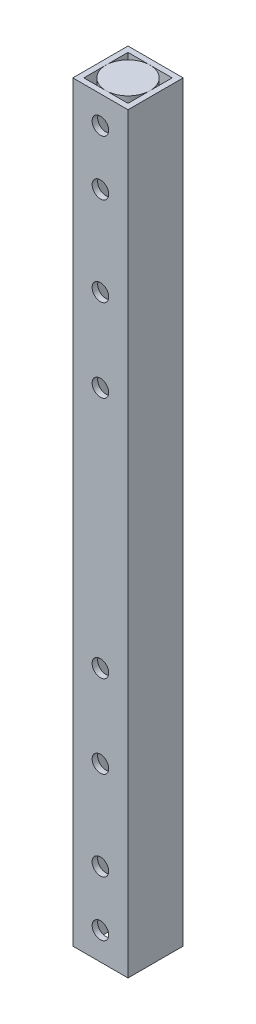
ISO-10303-21;
HEADER;
FILE_DESCRIPTION(('STEP AP214'),'2;1');
FILE_NAME('part.step','',(''),(''),'','','');
FILE_SCHEMA(('AUTOMOTIVE_DESIGN { 1 0 10303 214 1 1 1 1 }'));
ENDSEC;
DATA;
#1=APPLICATION_CONTEXT('core data for automotive mechanical design processes');
#2=APPLICATION_PROTOCOL_DEFINITION('international standard','automotive_design',2000,#1);
#3=PRODUCT_CONTEXT('',#1,'mechanical');
#4=PRODUCT('Part','Part','',(#3));
#5=PRODUCT_RELATED_PRODUCT_CATEGORY('part','',(#4));
#6=PRODUCT_DEFINITION_FORMATION('','',#4);
#7=PRODUCT_DEFINITION_CONTEXT('part definition',#1,'design');
#8=PRODUCT_DEFINITION('design','',#6,#7);
#9=PRODUCT_DEFINITION_SHAPE('','',#8);
#10=(LENGTH_UNIT() NAMED_UNIT(*) SI_UNIT(.MILLI.,.METRE.));
#11=(NAMED_UNIT(*) PLANE_ANGLE_UNIT() SI_UNIT($,.RADIAN.));
#12=(NAMED_UNIT(*) SI_UNIT($,.STERADIAN.) SOLID_ANGLE_UNIT());
#13=UNCERTAINTY_MEASURE_WITH_UNIT(LENGTH_MEASURE(1.E-05),#10,'distance_accuracy_value','');
#14=(GEOMETRIC_REPRESENTATION_CONTEXT(3) GLOBAL_UNCERTAINTY_ASSIGNED_CONTEXT((#13)) GLOBAL_UNIT_ASSIGNED_CONTEXT((#10,
#11,#12)) REPRESENTATION_CONTEXT('',''));
#15=CARTESIAN_POINT('',(0.,0.,0.));
#16=DIRECTION('',(0.,0.,1.));
#17=DIRECTION('',(1.,0.,0.));
#18=AXIS2_PLACEMENT_3D('',#15,#16,#17);
#19=CARTESIAN_POINT('',(0.,134.24,0.));
#20=DIRECTION('',(0.,1.,0.));
#21=DIRECTION('',(0.,0.,1.));
#22=AXIS2_PLACEMENT_3D('',#19,#20,#21);
#23=CYLINDRICAL_SURFACE('',#22,4.);
#24=CARTESIAN_POINT('',(0.,134.24,0.));
#25=DIRECTION('',(0.,1.,0.));
#26=DIRECTION('',(0.,0.,1.));
#27=AXIS2_PLACEMENT_3D('',#24,#25,#26);
#28=CIRCLE('',#27,4.);
#29=CARTESIAN_POINT('',(0.,134.24,4.));
#30=VERTEX_POINT('',#29);
#31=EDGE_CURVE('E11',#30,#30,#28,.T.);
#32=ORIENTED_EDGE('',*,*,#31,.T.);
#33=EDGE_LOOP('',(#32));
#34=FACE_BOUND('',#33,.T.);
#35=CARTESIAN_POINT('',(0.,136.24,0.));
#36=DIRECTION('',(0.,1.,0.));
#37=DIRECTION('',(0.,0.,1.));
#38=AXIS2_PLACEMENT_3D('',#35,#36,#37);
#39=CIRCLE('',#38,4.);
#40=CARTESIAN_POINT('',(0.,136.24,4.));
#41=VERTEX_POINT('',#40);
#42=EDGE_CURVE('E50',#41,#41,#39,.T.);
#43=ORIENTED_EDGE('',*,*,#42,.F.);
#44=EDGE_LOOP('',(#43));
#45=FACE_BOUND('',#44,.T.);
#46=ADVANCED_FACE('F47',(#34,#45),#23,.T.);
#47=CARTESIAN_POINT('',(0.,134.24,0.));
#48=DIRECTION('',(0.,1.,0.));
#49=DIRECTION('',(0.,0.,1.));
#50=AXIS2_PLACEMENT_3D('',#47,#48,#49);
#51=PLANE('',#50);
#52=ORIENTED_EDGE('',*,*,#31,.F.);
#53=EDGE_LOOP('',(#52));
#54=FACE_BOUND('',#53,.T.);
#55=ADVANCED_FACE('F62',(#54),#51,.F.);
#56=CARTESIAN_POINT('',(0.,136.24,0.));
#57=DIRECTION('',(0.,1.,0.));
#58=DIRECTION('',(0.,0.,1.));
#59=AXIS2_PLACEMENT_3D('',#56,#57,#58);
#60=PLANE('',#59);
#61=ORIENTED_EDGE('',*,*,#42,.T.);
#62=EDGE_LOOP('',(#61));
#63=FACE_BOUND('',#62,.T.);
#64=ADVANCED_FACE('F59',(#63),#60,.T.);
#65=CLOSED_SHELL('',(#46,#55,#64));
#66=MANIFOLD_SOLID_BREP('B2',#65);
#67=CARTESIAN_POINT('',(-2.72351585728359E-13,46.12,-5.));
#68=DIRECTION('',(0.,0.,1.));
#69=DIRECTION('',(1.,0.,0.));
#70=AXIS2_PLACEMENT_3D('',#67,#68,#69);
#71=CYLINDRICAL_SURFACE('',#70,1.5);
#72=CARTESIAN_POINT('',(-2.72351585728359E-13,46.12,4.));
#73=DIRECTION('',(0.,0.,1.));
#74=DIRECTION('',(1.,0.,0.));
#75=AXIS2_PLACEMENT_3D('',#72,#73,#74);
#76=CIRCLE('',#75,1.5);
#77=CARTESIAN_POINT('',(1.49999999999973,46.12,4.));
#78=VERTEX_POINT('',#77);
#79=EDGE_CURVE('E258',#78,#78,#76,.F.);
#80=ORIENTED_EDGE('',*,*,#79,.T.);
#81=EDGE_LOOP('',(#80));
#82=FACE_BOUND('',#81,.T.);
#83=CARTESIAN_POINT('',(-2.72351585728359E-13,46.12,5.));
#84=DIRECTION('',(0.,0.,1.));
#85=DIRECTION('',(1.,0.,0.));
#86=AXIS2_PLACEMENT_3D('',#83,#84,#85);
#87=CIRCLE('',#86,1.5);
#88=CARTESIAN_POINT('',(1.49999999999973,46.12,5.));
#89=VERTEX_POINT('',#88);
#90=EDGE_CURVE('E277',#89,#89,#87,.T.);
#91=ORIENTED_EDGE('',*,*,#90,.T.);
#92=EDGE_LOOP('',(#91));
#93=FACE_BOUND('',#92,.T.);
#94=ADVANCED_FACE('F88',(#82,#93),#71,.F.);
#95=CARTESIAN_POINT('',(0.,131.24,-5.));
#96=DIRECTION('',(0.,0.,1.));
#97=DIRECTION('',(1.,0.,0.));
#98=AXIS2_PLACEMENT_3D('',#95,#96,#97);
#99=CYLINDRICAL_SURFACE('',#98,1.5);
#100=CARTESIAN_POINT('',(0.,131.24,4.));
#101=DIRECTION('',(0.,0.,1.));
#102=DIRECTION('',(1.,0.,0.));
#103=AXIS2_PLACEMENT_3D('',#100,#101,#102);
#104=CIRCLE('',#103,1.5);
#105=CARTESIAN_POINT('',(1.5,131.24,4.));
#106=VERTEX_POINT('',#105);
#107=EDGE_CURVE('E254',#106,#106,#104,.F.);
#108=ORIENTED_EDGE('',*,*,#107,.T.);
#109=EDGE_LOOP('',(#108));
#110=FACE_BOUND('',#109,.T.);
#111=CARTESIAN_POINT('',(0.,131.24,5.));
#112=DIRECTION('',(0.,0.,1.));
#113=DIRECTION('',(-1.,0.,0.));
#114=AXIS2_PLACEMENT_3D('',#111,#112,#113);
#115=CIRCLE('',#114,1.5);
#116=CARTESIAN_POINT('',(-1.5,131.24,5.));
#117=VERTEX_POINT('',#116);
#118=EDGE_CURVE('E302',#117,#117,#115,.T.);
#119=ORIENTED_EDGE('',*,*,#118,.T.);
#120=EDGE_LOOP('',(#119));
#121=FACE_BOUND('',#120,.T.);
#122=ADVANCED_FACE('F385',(#110,#121),#99,.F.);
#123=CARTESIAN_POINT('',(0.,121.24,-5.));
#124=DIRECTION('',(0.,0.,1.));
#125=DIRECTION('',(1.,0.,0.));
#126=AXIS2_PLACEMENT_3D('',#123,#124,#125);
#127=CYLINDRICAL_SURFACE('',#126,1.5);
#128=CARTESIAN_POINT('',(0.,121.24,4.));
#129=DIRECTION('',(0.,0.,1.));
#130=DIRECTION('',(1.,0.,0.));
#131=AXIS2_PLACEMENT_3D('',#128,#129,#130);
#132=CIRCLE('',#131,1.5);
#133=CARTESIAN_POINT('',(1.49999999999997,121.24,4.));
#134=VERTEX_POINT('',#133);
#135=EDGE_CURVE('E250',#134,#134,#132,.F.);
#136=ORIENTED_EDGE('',*,*,#135,.T.);
#137=EDGE_LOOP('',(#136));
#138=FACE_BOUND('',#137,.T.);
#139=CARTESIAN_POINT('',(0.,121.24,5.));
#140=DIRECTION('',(0.,0.,1.));
#141=DIRECTION('',(-1.,0.,0.));
#142=AXIS2_PLACEMENT_3D('',#139,#140,#141);
#143=CIRCLE('',#142,1.5);
#144=CARTESIAN_POINT('',(-1.50000000000004,121.24,5.));
#145=VERTEX_POINT('',#144);
#146=EDGE_CURVE('E301',#145,#145,#143,.T.);
#147=ORIENTED_EDGE('',*,*,#146,.T.);
#148=EDGE_LOOP('',(#147));
#149=FACE_BOUND('',#148,.T.);
#150=ADVANCED_FACE('F392',(#138,#149),#127,.F.);
#151=CARTESIAN_POINT('',(0.,15.,-5.));
#152=DIRECTION('',(0.,0.,1.));
#153=DIRECTION('',(1.,0.,0.));
#154=AXIS2_PLACEMENT_3D('',#151,#152,#153);
#155=CYLINDRICAL_SURFACE('',#154,1.5);
#156=CARTESIAN_POINT('',(0.,15.,4.));
#157=DIRECTION('',(0.,0.,1.));
#158=DIRECTION('',(1.,0.,0.));
#159=AXIS2_PLACEMENT_3D('',#156,#157,#158);
#160=CIRCLE('',#159,1.5);
#161=CARTESIAN_POINT('',(1.49999999999995,15.,4.));
#162=VERTEX_POINT('',#161);
#163=EDGE_CURVE('E246',#162,#162,#160,.F.);
#164=ORIENTED_EDGE('',*,*,#163,.T.);
#165=EDGE_LOOP('',(#164));
#166=FACE_BOUND('',#165,.T.);
#167=CARTESIAN_POINT('',(0.,15.,5.));
#168=DIRECTION('',(0.,0.,1.));
#169=DIRECTION('',(1.,0.,0.));
#170=AXIS2_PLACEMENT_3D('',#167,#168,#169);
#171=CIRCLE('',#170,1.5);
#172=CARTESIAN_POINT('',(1.49999999999995,15.,5.));
#173=VERTEX_POINT('',#172);
#174=EDGE_CURVE('E316',#173,#173,#171,.T.);
#175=ORIENTED_EDGE('',*,*,#174,.T.);
#176=EDGE_LOOP('',(#175));
#177=FACE_BOUND('',#176,.T.);
#178=ADVANCED_FACE('F476',(#166,#177),#155,.F.);
#179=CARTESIAN_POINT('',(-2.72351585728359E-13,90.12,-5.));
#180=DIRECTION('',(0.,0.,1.));
#181=DIRECTION('',(1.,0.,0.));
#182=AXIS2_PLACEMENT_3D('',#179,#180,#181);
#183=CYLINDRICAL_SURFACE('',#182,1.5);
#184=CARTESIAN_POINT('',(-2.72351585728359E-13,90.12,4.));
#185=DIRECTION('',(0.,0.,1.));
#186=DIRECTION('',(1.,0.,0.));
#187=AXIS2_PLACEMENT_3D('',#184,#185,#186);
#188=CIRCLE('',#187,1.5);
#189=CARTESIAN_POINT('',(1.49999999999973,90.12,4.));
#190=VERTEX_POINT('',#189);
#191=EDGE_CURVE('E242',#190,#190,#188,.F.);
#192=ORIENTED_EDGE('',*,*,#191,.T.);
#193=EDGE_LOOP('',(#192));
#194=FACE_BOUND('',#193,.T.);
#195=CARTESIAN_POINT('',(-2.72351585728359E-13,90.12,5.));
#196=DIRECTION('',(0.,0.,1.));
#197=DIRECTION('',(-1.,0.,0.));
#198=AXIS2_PLACEMENT_3D('',#195,#196,#197);
#199=CIRCLE('',#198,1.5);
#200=CARTESIAN_POINT('',(-1.50000000000027,90.12,5.));
#201=VERTEX_POINT('',#200);
#202=EDGE_CURVE('E278',#201,#201,#199,.T.);
#203=ORIENTED_EDGE('',*,*,#202,.T.);
#204=EDGE_LOOP('',(#203));
#205=FACE_BOUND('',#204,.T.);
#206=ADVANCED_FACE('F485',(#194,#205),#183,.F.);
#207=CARTESIAN_POINT('',(-2.72351585728359E-13,31.12,-5.));
#208=DIRECTION('',(0.,0.,1.));
#209=DIRECTION('',(1.,0.,0.));
#210=AXIS2_PLACEMENT_3D('',#207,#208,#209);
#211=CYLINDRICAL_SURFACE('',#210,1.5);
#212=CARTESIAN_POINT('',(-2.72351585728359E-13,31.12,4.));
#213=DIRECTION('',(0.,0.,1.));
#214=DIRECTION('',(1.,0.,0.));
#215=AXIS2_PLACEMENT_3D('',#212,#213,#214);
#216=CIRCLE('',#215,1.5);
#217=CARTESIAN_POINT('',(1.49999999999973,31.12,4.));
#218=VERTEX_POINT('',#217);
#219=EDGE_CURVE('E238',#218,#218,#216,.F.);
#220=ORIENTED_EDGE('',*,*,#219,.T.);
#221=EDGE_LOOP('',(#220));
#222=FACE_BOUND('',#221,.T.);
#223=CARTESIAN_POINT('',(-2.72351585728359E-13,31.12,5.));
#224=DIRECTION('',(0.,0.,1.));
#225=DIRECTION('',(1.,0.,0.));
#226=AXIS2_PLACEMENT_3D('',#223,#224,#225);
#227=CIRCLE('',#226,1.5);
#228=CARTESIAN_POINT('',(1.49999999999973,31.12,5.));
#229=VERTEX_POINT('',#228);
#230=EDGE_CURVE('E286',#229,#229,#227,.T.);
#231=ORIENTED_EDGE('',*,*,#230,.T.);
#232=EDGE_LOOP('',(#231));
#233=FACE_BOUND('',#232,.T.);
#234=ADVANCED_FACE('F495',(#222,#233),#211,.F.);
#235=CARTESIAN_POINT('',(-2.72351585728359E-13,105.12,-5.));
#236=DIRECTION('',(0.,0.,1.));
#237=DIRECTION('',(1.,0.,0.));
#238=AXIS2_PLACEMENT_3D('',#235,#236,#237);
#239=CYLINDRICAL_SURFACE('',#238,1.5);
#240=CARTESIAN_POINT('',(-2.72351585728359E-13,105.12,4.));
#241=DIRECTION('',(0.,0.,1.));
#242=DIRECTION('',(1.,0.,0.));
#243=AXIS2_PLACEMENT_3D('',#240,#241,#242);
#244=CIRCLE('',#243,1.5);
#245=CARTESIAN_POINT('',(1.49999999999973,105.12,4.));
#246=VERTEX_POINT('',#245);
#247=EDGE_CURVE('E234',#246,#246,#244,.F.);
#248=ORIENTED_EDGE('',*,*,#247,.T.);
#249=EDGE_LOOP('',(#248));
#250=FACE_BOUND('',#249,.T.);
#251=CARTESIAN_POINT('',(-2.72351585728359E-13,105.12,5.));
#252=DIRECTION('',(0.,0.,1.));
#253=DIRECTION('',(-1.,0.,0.));
#254=AXIS2_PLACEMENT_3D('',#251,#252,#253);
#255=CIRCLE('',#254,1.5);
#256=CARTESIAN_POINT('',(-1.50000000000027,105.12,5.));
#257=VERTEX_POINT('',#256);
#258=EDGE_CURVE('E262',#257,#257,#255,.T.);
#259=ORIENTED_EDGE('',*,*,#258,.T.);
#260=EDGE_LOOP('',(#259));
#261=FACE_BOUND('',#260,.T.);
#262=ADVANCED_FACE('F506',(#250,#261),#239,.F.);
#263=CARTESIAN_POINT('',(0.,5.,-5.));
#264=DIRECTION('',(0.,0.,1.));
#265=DIRECTION('',(1.,0.,0.));
#266=AXIS2_PLACEMENT_3D('',#263,#264,#265);
#267=CYLINDRICAL_SURFACE('',#266,1.5);
#268=CARTESIAN_POINT('',(0.,5.,4.));
#269=DIRECTION('',(0.,0.,1.));
#270=DIRECTION('',(1.,0.,0.));
#271=AXIS2_PLACEMENT_3D('',#268,#269,#270);
#272=CIRCLE('',#271,1.5);
#273=CARTESIAN_POINT('',(1.49999999999998,5.,4.));
#274=VERTEX_POINT('',#273);
#275=EDGE_CURVE('E92',#274,#274,#272,.F.);
#276=ORIENTED_EDGE('',*,*,#275,.T.);
#277=EDGE_LOOP('',(#276));
#278=FACE_BOUND('',#277,.T.);
#279=CARTESIAN_POINT('',(0.,5.,5.));
#280=DIRECTION('',(0.,0.,1.));
#281=DIRECTION('',(1.,0.,0.));
#282=AXIS2_PLACEMENT_3D('',#279,#280,#281);
#283=CIRCLE('',#282,1.5);
#284=CARTESIAN_POINT('',(1.49999999999998,5.,5.));
#285=VERTEX_POINT('',#284);
#286=EDGE_CURVE('E268',#285,#285,#283,.T.);
#287=ORIENTED_EDGE('',*,*,#286,.T.);
#288=EDGE_LOOP('',(#287));
#289=FACE_BOUND('',#288,.T.);
#290=ADVANCED_FACE('F517',(#278,#289),#267,.F.);
#291=CARTESIAN_POINT('',(5.,136.24,-5.));
#292=DIRECTION('',(-1.,0.,0.));
#293=DIRECTION('',(0.,0.,1.));
#294=AXIS2_PLACEMENT_3D('',#291,#292,#293);
#295=PLANE('',#294);
#296=DIRECTION('',(0.,0.,-1.));
#297=VECTOR('',#296,1.);
#298=CARTESIAN_POINT('',(5.,0.,-5.));
#299=LINE('',#298,#297);
#300=CARTESIAN_POINT('',(5.,0.,5.));
#301=VERTEX_POINT('',#300);
#302=CARTESIAN_POINT('',(5.,0.,-5.));
#303=VERTEX_POINT('',#302);
#304=EDGE_CURVE('E267',#301,#303,#299,.T.);
#305=ORIENTED_EDGE('',*,*,#304,.T.);
#306=DIRECTION('',(0.,-1.,0.));
#307=VECTOR('',#306,1.);
#308=CARTESIAN_POINT('',(5.,136.24,-5.));
#309=LINE('',#308,#307);
#310=CARTESIAN_POINT('',(5.,136.24,-5.));
#311=VERTEX_POINT('',#310);
#312=EDGE_CURVE('E45',#311,#303,#309,.T.);
#313=ORIENTED_EDGE('',*,*,#312,.F.);
#314=DIRECTION('',(0.,0.,-1.));
#315=VECTOR('',#314,1.);
#316=CARTESIAN_POINT('',(5.,136.24,-5.));
#317=LINE('',#316,#315);
#318=CARTESIAN_POINT('',(5.,136.24,5.));
#319=VERTEX_POINT('',#318);
#320=EDGE_CURVE('E327',#319,#311,#317,.T.);
#321=ORIENTED_EDGE('',*,*,#320,.F.);
#322=DIRECTION('',(0.,-1.,0.));
#323=VECTOR('',#322,1.);
#324=CARTESIAN_POINT('',(5.,136.24,5.));
#325=LINE('',#324,#323);
#326=EDGE_CURVE('E341',#319,#301,#325,.T.);
#327=ORIENTED_EDGE('',*,*,#326,.T.);
#328=EDGE_LOOP('',(#305,#313,#321,#327));
#329=FACE_BOUND('',#328,.T.);
#330=ADVANCED_FACE('F90',(#329),#295,.F.);
#331=CARTESIAN_POINT('',(-5.,136.24,-5.));
#332=DIRECTION('',(0.,0.,1.));
#333=DIRECTION('',(1.,0.,0.));
#334=AXIS2_PLACEMENT_3D('',#331,#332,#333);
#335=PLANE('',#334);
#336=CARTESIAN_POINT('',(0.,5.,-5.));
#337=DIRECTION('',(0.,0.,1.));
#338=DIRECTION('',(1.,0.,0.));
#339=AXIS2_PLACEMENT_3D('',#336,#337,#338);
#340=CIRCLE('',#339,1.5);
#341=CARTESIAN_POINT('',(1.49999999999998,5.,-5.));
#342=VERTEX_POINT('',#341);
#343=EDGE_CURVE('E263',#342,#342,#340,.T.);
#344=ORIENTED_EDGE('',*,*,#343,.T.);
#345=EDGE_LOOP('',(#344));
#346=FACE_BOUND('',#345,.T.);
#347=CARTESIAN_POINT('',(-2.72351585728359E-13,105.12,-5.));
#348=DIRECTION('',(0.,0.,1.));
#349=DIRECTION('',(-1.,0.,0.));
#350=AXIS2_PLACEMENT_3D('',#347,#348,#349);
#351=CIRCLE('',#350,1.5);
#352=CARTESIAN_POINT('',(-1.50000000000027,105.12,-5.));
#353=VERTEX_POINT('',#352);
#354=EDGE_CURVE('E290',#353,#353,#351,.T.);
#355=ORIENTED_EDGE('',*,*,#354,.T.);
#356=EDGE_LOOP('',(#355));
#357=FACE_BOUND('',#356,.T.);
#358=CARTESIAN_POINT('',(-2.72351585728359E-13,31.12,-5.));
#359=DIRECTION('',(0.,0.,1.));
#360=DIRECTION('',(1.,0.,0.));
#361=AXIS2_PLACEMENT_3D('',#358,#359,#360);
#362=CIRCLE('',#361,1.5);
#363=CARTESIAN_POINT('',(1.49999999999973,31.12,-5.));
#364=VERTEX_POINT('',#363);
#365=EDGE_CURVE('E282',#364,#364,#362,.T.);
#366=ORIENTED_EDGE('',*,*,#365,.T.);
#367=EDGE_LOOP('',(#366));
#368=FACE_BOUND('',#367,.T.);
#369=CARTESIAN_POINT('',(-2.72351585728359E-13,90.12,-5.));
#370=DIRECTION('',(0.,0.,1.));
#371=DIRECTION('',(-1.,0.,0.));
#372=AXIS2_PLACEMENT_3D('',#369,#370,#371);
#373=CIRCLE('',#372,1.5);
#374=CARTESIAN_POINT('',(-1.50000000000027,90.12,-5.));
#375=VERTEX_POINT('',#374);
#376=EDGE_CURVE('E273',#375,#375,#373,.T.);
#377=ORIENTED_EDGE('',*,*,#376,.T.);
#378=EDGE_LOOP('',(#377));
#379=FACE_BOUND('',#378,.T.);
#380=CARTESIAN_POINT('',(0.,15.,-5.));
#381=DIRECTION('',(0.,0.,1.));
#382=DIRECTION('',(1.,0.,0.));
#383=AXIS2_PLACEMENT_3D('',#380,#381,#382);
#384=CIRCLE('',#383,1.5);
#385=CARTESIAN_POINT('',(1.49999999999995,15.,-5.));
#386=VERTEX_POINT('',#385);
#387=EDGE_CURVE('E272',#386,#386,#384,.T.);
#388=ORIENTED_EDGE('',*,*,#387,.T.);
#389=EDGE_LOOP('',(#388));
#390=FACE_BOUND('',#389,.T.);
#391=CARTESIAN_POINT('',(0.,121.24,-5.));
#392=DIRECTION('',(0.,0.,1.));
#393=DIRECTION('',(-1.,0.,0.));
#394=AXIS2_PLACEMENT_3D('',#391,#392,#393);
#395=CIRCLE('',#394,1.5);
#396=CARTESIAN_POINT('',(-1.50000000000004,121.24,-5.));
#397=VERTEX_POINT('',#396);
#398=EDGE_CURVE('E320',#397,#397,#395,.T.);
#399=ORIENTED_EDGE('',*,*,#398,.T.);
#400=EDGE_LOOP('',(#399));
#401=FACE_BOUND('',#400,.T.);
#402=CARTESIAN_POINT('',(0.,131.24,-5.));
#403=DIRECTION('',(0.,0.,1.));
#404=DIRECTION('',(-1.,0.,0.));
#405=AXIS2_PLACEMENT_3D('',#402,#403,#404);
#406=CIRCLE('',#405,1.5);
#407=CARTESIAN_POINT('',(-1.5,131.24,-5.));
#408=VERTEX_POINT('',#407);
#409=EDGE_CURVE('E297',#408,#408,#406,.T.);
#410=ORIENTED_EDGE('',*,*,#409,.T.);
#411=EDGE_LOOP('',(#410));
#412=FACE_BOUND('',#411,.T.);
#413=CARTESIAN_POINT('',(-2.72351585728359E-13,46.12,-5.));
#414=DIRECTION('',(0.,0.,1.));
#415=DIRECTION('',(1.,0.,0.));
#416=AXIS2_PLACEMENT_3D('',#413,#414,#415);
#417=CIRCLE('',#416,1.5);
#418=CARTESIAN_POINT('',(1.49999999999973,46.12,-5.));
#419=VERTEX_POINT('',#418);
#420=EDGE_CURVE('E306',#419,#419,#417,.T.);
#421=ORIENTED_EDGE('',*,*,#420,.T.);
#422=EDGE_LOOP('',(#421));
#423=FACE_BOUND('',#422,.T.);
#424=DIRECTION('',(-1.,0.,0.));
#425=VECTOR('',#424,1.);
#426=CARTESIAN_POINT('',(-5.,0.,-5.));
#427=LINE('',#426,#425);
#428=CARTESIAN_POINT('',(-5.,0.,-5.));
#429=VERTEX_POINT('',#428);
#430=EDGE_CURVE('E345',#303,#429,#427,.T.);
#431=ORIENTED_EDGE('',*,*,#430,.T.);
#432=DIRECTION('',(0.,-1.,0.));
#433=VECTOR('',#432,1.);
#434=CARTESIAN_POINT('',(-5.,136.24,-5.));
#435=LINE('',#434,#433);
#436=CARTESIAN_POINT('',(-5.,136.24,-5.));
#437=VERTEX_POINT('',#436);
#438=EDGE_CURVE('E98',#437,#429,#435,.T.);
#439=ORIENTED_EDGE('',*,*,#438,.F.);
#440=DIRECTION('',(-1.,0.,0.));
#441=VECTOR('',#440,1.);
#442=CARTESIAN_POINT('',(-5.,136.24,-5.));
#443=LINE('',#442,#441);
#444=EDGE_CURVE('E331',#311,#437,#443,.T.);
#445=ORIENTED_EDGE('',*,*,#444,.F.);
#446=ORIENTED_EDGE('',*,*,#312,.T.);
#447=EDGE_LOOP('',(#431,#439,#445,#446));
#448=FACE_BOUND('',#447,.T.);
#449=ADVANCED_FACE('F412',(#346,#357,#368,#379,#390,#401,#412,#423,#448),#335,.F.);
#450=CARTESIAN_POINT('',(-5.,136.24,-5.));
#451=DIRECTION('',(1.,0.,0.));
#452=DIRECTION('',(0.,0.,-1.));
#453=AXIS2_PLACEMENT_3D('',#450,#451,#452);
#454=PLANE('',#453);
#455=DIRECTION('',(0.,0.,1.));
#456=VECTOR('',#455,1.);
#457=CARTESIAN_POINT('',(-5.,0.,-5.));
#458=LINE('',#457,#456);
#459=CARTESIAN_POINT('',(-5.,0.,5.));
#460=VERTEX_POINT('',#459);
#461=EDGE_CURVE('E348',#429,#460,#458,.T.);
#462=ORIENTED_EDGE('',*,*,#461,.T.);
#463=DIRECTION('',(0.,-1.,0.));
#464=VECTOR('',#463,1.);
#465=CARTESIAN_POINT('',(-5.,136.24,5.));
#466=LINE('',#465,#464);
#467=CARTESIAN_POINT('',(-5.,136.24,5.));
#468=VERTEX_POINT('',#467);
#469=EDGE_CURVE('E356',#468,#460,#466,.T.);
#470=ORIENTED_EDGE('',*,*,#469,.F.);
#471=DIRECTION('',(0.,0.,1.));
#472=VECTOR('',#471,1.);
#473=CARTESIAN_POINT('',(-5.,136.24,-5.));
#474=LINE('',#473,#472);
#475=EDGE_CURVE('E335',#437,#468,#474,.T.);
#476=ORIENTED_EDGE('',*,*,#475,.F.);
#477=ORIENTED_EDGE('',*,*,#438,.T.);
#478=EDGE_LOOP('',(#462,#470,#476,#477));
#479=FACE_BOUND('',#478,.T.);
#480=ADVANCED_FACE('F415',(#479),#454,.F.);
#481=CARTESIAN_POINT('',(-5.,136.24,5.));
#482=DIRECTION('',(0.,0.,-1.));
#483=DIRECTION('',(-1.,0.,0.));
#484=AXIS2_PLACEMENT_3D('',#481,#482,#483);
#485=PLANE('',#484);
#486=ORIENTED_EDGE('',*,*,#286,.F.);
#487=EDGE_LOOP('',(#486));
#488=FACE_BOUND('',#487,.T.);
#489=ORIENTED_EDGE('',*,*,#258,.F.);
#490=EDGE_LOOP('',(#489));
#491=FACE_BOUND('',#490,.T.);
#492=ORIENTED_EDGE('',*,*,#230,.F.);
#493=EDGE_LOOP('',(#492));
#494=FACE_BOUND('',#493,.T.);
#495=ORIENTED_EDGE('',*,*,#202,.F.);
#496=EDGE_LOOP('',(#495));
#497=FACE_BOUND('',#496,.T.);
#498=ORIENTED_EDGE('',*,*,#174,.F.);
#499=EDGE_LOOP('',(#498));
#500=FACE_BOUND('',#499,.T.);
#501=ORIENTED_EDGE('',*,*,#146,.F.);
#502=EDGE_LOOP('',(#501));
#503=FACE_BOUND('',#502,.T.);
#504=ORIENTED_EDGE('',*,*,#118,.F.);
#505=EDGE_LOOP('',(#504));
#506=FACE_BOUND('',#505,.T.);
#507=ORIENTED_EDGE('',*,*,#90,.F.);
#508=EDGE_LOOP('',(#507));
#509=FACE_BOUND('',#508,.T.);
#510=DIRECTION('',(1.,0.,0.));
#511=VECTOR('',#510,1.);
#512=CARTESIAN_POINT('',(-5.,0.,5.));
#513=LINE('',#512,#511);
#514=EDGE_CURVE('E332',#460,#301,#513,.T.);
#515=ORIENTED_EDGE('',*,*,#514,.T.);
#516=ORIENTED_EDGE('',*,*,#326,.F.);
#517=DIRECTION('',(1.,0.,0.));
#518=VECTOR('',#517,1.);
#519=CARTESIAN_POINT('',(-5.,136.24,5.));
#520=LINE('',#519,#518);
#521=EDGE_CURVE('E338',#468,#319,#520,.T.);
#522=ORIENTED_EDGE('',*,*,#521,.F.);
#523=ORIENTED_EDGE('',*,*,#469,.T.);
#524=EDGE_LOOP('',(#515,#516,#522,#523));
#525=FACE_BOUND('',#524,.T.);
#526=ADVANCED_FACE('F427',(#488,#491,#494,#497,#500,#503,#506,#509,#525),#485,.F.);
#527=CARTESIAN_POINT('',(0.,136.24,0.));
#528=DIRECTION('',(0.,1.,0.));
#529=DIRECTION('',(0.,0.,1.));
#530=AXIS2_PLACEMENT_3D('',#527,#528,#529);
#531=PLANE('',#530);
#532=DIRECTION('',(0.,0.,-1.));
#533=VECTOR('',#532,1.);
#534=CARTESIAN_POINT('',(4.,136.24,-4.));
#535=LINE('',#534,#533);
#536=CARTESIAN_POINT('',(4.,136.24,4.));
#537=VERTEX_POINT('',#536);
#538=CARTESIAN_POINT('',(4.,136.24,-4.));
#539=VERTEX_POINT('',#538);
#540=EDGE_CURVE('E106',#537,#539,#535,.T.);
#541=ORIENTED_EDGE('',*,*,#540,.F.);
#542=DIRECTION('',(1.,0.,0.));
#543=VECTOR('',#542,1.);
#544=CARTESIAN_POINT('',(-4.,136.24,4.));
#545=LINE('',#544,#543);
#546=CARTESIAN_POINT('',(-4.,136.24,4.));
#547=VERTEX_POINT('',#546);
#548=EDGE_CURVE('E178',#547,#537,#545,.T.);
#549=ORIENTED_EDGE('',*,*,#548,.F.);
#550=DIRECTION('',(0.,0.,1.));
#551=VECTOR('',#550,1.);
#552=CARTESIAN_POINT('',(-4.,136.24,-4.));
#553=LINE('',#552,#551);
#554=CARTESIAN_POINT('',(-4.,136.24,-4.));
#555=VERTEX_POINT('',#554);
#556=EDGE_CURVE('E182',#555,#547,#553,.T.);
#557=ORIENTED_EDGE('',*,*,#556,.F.);
#558=DIRECTION('',(-1.,0.,0.));
#559=VECTOR('',#558,1.);
#560=CARTESIAN_POINT('',(-4.,136.24,-4.));
#561=LINE('',#560,#559);
#562=EDGE_CURVE('E191',#539,#555,#561,.T.);
#563=ORIENTED_EDGE('',*,*,#562,.F.);
#564=EDGE_LOOP('',(#541,#549,#557,#563));
#565=FACE_BOUND('',#564,.T.);
#566=ORIENTED_EDGE('',*,*,#320,.T.);
#567=ORIENTED_EDGE('',*,*,#444,.T.);
#568=ORIENTED_EDGE('',*,*,#475,.T.);
#569=ORIENTED_EDGE('',*,*,#521,.T.);
#570=EDGE_LOOP('',(#566,#567,#568,#569));
#571=FACE_BOUND('',#570,.T.);
#572=ADVANCED_FACE('F406',(#565,#571),#531,.T.);
#573=CARTESIAN_POINT('',(0.,0.,0.));
#574=DIRECTION('',(0.,1.,0.));
#575=DIRECTION('',(0.,0.,1.));
#576=AXIS2_PLACEMENT_3D('',#573,#574,#575);
#577=PLANE('',#576);
#578=DIRECTION('',(1.,0.,0.));
#579=VECTOR('',#578,1.);
#580=CARTESIAN_POINT('',(-4.,0.,4.));
#581=LINE('',#580,#579);
#582=CARTESIAN_POINT('',(-4.,0.,4.));
#583=VERTEX_POINT('',#582);
#584=CARTESIAN_POINT('',(4.,0.,4.));
#585=VERTEX_POINT('',#584);
#586=EDGE_CURVE('E165',#583,#585,#581,.T.);
#587=ORIENTED_EDGE('',*,*,#586,.T.);
#588=DIRECTION('',(0.,0.,-1.));
#589=VECTOR('',#588,1.);
#590=CARTESIAN_POINT('',(4.,0.,-4.));
#591=LINE('',#590,#589);
#592=CARTESIAN_POINT('',(4.,0.,-4.));
#593=VERTEX_POINT('',#592);
#594=EDGE_CURVE('E158',#585,#593,#591,.T.);
#595=ORIENTED_EDGE('',*,*,#594,.T.);
#596=DIRECTION('',(-1.,0.,0.));
#597=VECTOR('',#596,1.);
#598=CARTESIAN_POINT('',(-4.,0.,-4.));
#599=LINE('',#598,#597);
#600=CARTESIAN_POINT('',(-4.,0.,-4.));
#601=VERTEX_POINT('',#600);
#602=EDGE_CURVE('E168',#593,#601,#599,.T.);
#603=ORIENTED_EDGE('',*,*,#602,.T.);
#604=DIRECTION('',(0.,0.,1.));
#605=VECTOR('',#604,1.);
#606=CARTESIAN_POINT('',(-4.,0.,-4.));
#607=LINE('',#606,#605);
#608=EDGE_CURVE('E114',#601,#583,#607,.T.);
#609=ORIENTED_EDGE('',*,*,#608,.T.);
#610=EDGE_LOOP('',(#587,#595,#603,#609));
#611=FACE_BOUND('',#610,.T.);
#612=ORIENTED_EDGE('',*,*,#304,.F.);
#613=ORIENTED_EDGE('',*,*,#514,.F.);
#614=ORIENTED_EDGE('',*,*,#461,.F.);
#615=ORIENTED_EDGE('',*,*,#430,.F.);
#616=EDGE_LOOP('',(#612,#613,#614,#615));
#617=FACE_BOUND('',#616,.T.);
#618=ADVANCED_FACE('F174',(#611,#617),#577,.F.);
#619=CARTESIAN_POINT('',(-2.72351585728359E-13,46.12,-4.));
#620=DIRECTION('',(0.,0.,-1.));
#621=DIRECTION('',(-1.,0.,0.));
#622=AXIS2_PLACEMENT_3D('',#619,#620,#621);
#623=CIRCLE('',#622,1.5);
#624=CARTESIAN_POINT('',(-1.50000000000027,46.12,-4.));
#625=VERTEX_POINT('',#624);
#626=EDGE_CURVE('E230',#625,#625,#623,.F.);
#627=ORIENTED_EDGE('',*,*,#626,.T.);
#628=EDGE_LOOP('',(#627));
#629=FACE_BOUND('',#628,.T.);
#630=ORIENTED_EDGE('',*,*,#420,.F.);
#631=EDGE_LOOP('',(#630));
#632=FACE_BOUND('',#631,.T.);
#633=ADVANCED_FACE('F388',(#629,#632),#71,.F.);
#634=CARTESIAN_POINT('',(0.,131.24,-4.));
#635=DIRECTION('',(0.,0.,-1.));
#636=DIRECTION('',(-1.,0.,0.));
#637=AXIS2_PLACEMENT_3D('',#634,#635,#636);
#638=CIRCLE('',#637,1.5);
#639=CARTESIAN_POINT('',(-1.5,131.24,-4.));
#640=VERTEX_POINT('',#639);
#641=EDGE_CURVE('E226',#640,#640,#638,.F.);
#642=ORIENTED_EDGE('',*,*,#641,.T.);
#643=EDGE_LOOP('',(#642));
#644=FACE_BOUND('',#643,.T.);
#645=ORIENTED_EDGE('',*,*,#409,.F.);
#646=EDGE_LOOP('',(#645));
#647=FACE_BOUND('',#646,.T.);
#648=ADVANCED_FACE('F395',(#644,#647),#99,.F.);
#649=CARTESIAN_POINT('',(0.,121.24,-4.));
#650=DIRECTION('',(0.,0.,-1.));
#651=DIRECTION('',(-1.,0.,0.));
#652=AXIS2_PLACEMENT_3D('',#649,#650,#651);
#653=CIRCLE('',#652,1.5);
#654=CARTESIAN_POINT('',(-1.50000000000004,121.24,-4.));
#655=VERTEX_POINT('',#654);
#656=EDGE_CURVE('E222',#655,#655,#653,.F.);
#657=ORIENTED_EDGE('',*,*,#656,.T.);
#658=EDGE_LOOP('',(#657));
#659=FACE_BOUND('',#658,.T.);
#660=ORIENTED_EDGE('',*,*,#398,.F.);
#661=EDGE_LOOP('',(#660));
#662=FACE_BOUND('',#661,.T.);
#663=ADVANCED_FACE('F404',(#659,#662),#127,.F.);
#664=CARTESIAN_POINT('',(0.,15.,-4.));
#665=DIRECTION('',(0.,0.,-1.));
#666=DIRECTION('',(-1.,0.,0.));
#667=AXIS2_PLACEMENT_3D('',#664,#665,#666);
#668=CIRCLE('',#667,1.5);
#669=CARTESIAN_POINT('',(-1.50000000000005,15.,-4.));
#670=VERTEX_POINT('',#669);
#671=EDGE_CURVE('E218',#670,#670,#668,.F.);
#672=ORIENTED_EDGE('',*,*,#671,.T.);
#673=EDGE_LOOP('',(#672));
#674=FACE_BOUND('',#673,.T.);
#675=ORIENTED_EDGE('',*,*,#387,.F.);
#676=EDGE_LOOP('',(#675));
#677=FACE_BOUND('',#676,.T.);
#678=ADVANCED_FACE('F487',(#674,#677),#155,.F.);
#679=CARTESIAN_POINT('',(-2.72351585728359E-13,90.12,-4.));
#680=DIRECTION('',(0.,0.,-1.));
#681=DIRECTION('',(-1.,0.,0.));
#682=AXIS2_PLACEMENT_3D('',#679,#680,#681);
#683=CIRCLE('',#682,1.5);
#684=CARTESIAN_POINT('',(-1.50000000000027,90.12,-4.));
#685=VERTEX_POINT('',#684);
#686=EDGE_CURVE('E214',#685,#685,#683,.F.);
#687=ORIENTED_EDGE('',*,*,#686,.T.);
#688=EDGE_LOOP('',(#687));
#689=FACE_BOUND('',#688,.T.);
#690=ORIENTED_EDGE('',*,*,#376,.F.);
#691=EDGE_LOOP('',(#690));
#692=FACE_BOUND('',#691,.T.);
#693=ADVANCED_FACE('F498',(#689,#692),#183,.F.);
#694=CARTESIAN_POINT('',(-2.72351585728359E-13,31.12,-4.));
#695=DIRECTION('',(0.,0.,-1.));
#696=DIRECTION('',(-1.,0.,0.));
#697=AXIS2_PLACEMENT_3D('',#694,#695,#696);
#698=CIRCLE('',#697,1.5);
#699=CARTESIAN_POINT('',(-1.50000000000027,31.12,-4.));
#700=VERTEX_POINT('',#699);
#701=EDGE_CURVE('E210',#700,#700,#698,.F.);
#702=ORIENTED_EDGE('',*,*,#701,.T.);
#703=EDGE_LOOP('',(#702));
#704=FACE_BOUND('',#703,.T.);
#705=ORIENTED_EDGE('',*,*,#365,.F.);
#706=EDGE_LOOP('',(#705));
#707=FACE_BOUND('',#706,.T.);
#708=ADVANCED_FACE('F509',(#704,#707),#211,.F.);
#709=CARTESIAN_POINT('',(-2.72351585728359E-13,105.12,-4.));
#710=DIRECTION('',(0.,0.,-1.));
#711=DIRECTION('',(-1.,0.,0.));
#712=AXIS2_PLACEMENT_3D('',#709,#710,#711);
#713=CIRCLE('',#712,1.5);
#714=CARTESIAN_POINT('',(-1.50000000000027,105.12,-4.));
#715=VERTEX_POINT('',#714);
#716=EDGE_CURVE('E206',#715,#715,#713,.F.);
#717=ORIENTED_EDGE('',*,*,#716,.T.);
#718=EDGE_LOOP('',(#717));
#719=FACE_BOUND('',#718,.T.);
#720=ORIENTED_EDGE('',*,*,#354,.F.);
#721=EDGE_LOOP('',(#720));
#722=FACE_BOUND('',#721,.T.);
#723=ADVANCED_FACE('F520',(#719,#722),#239,.F.);
#724=CARTESIAN_POINT('',(0.,5.,-4.));
#725=DIRECTION('',(0.,0.,-1.));
#726=DIRECTION('',(-1.,0.,0.));
#727=AXIS2_PLACEMENT_3D('',#724,#725,#726);
#728=CIRCLE('',#727,1.5);
#729=CARTESIAN_POINT('',(-1.50000000000002,5.,-4.));
#730=VERTEX_POINT('',#729);
#731=EDGE_CURVE('E200',#730,#730,#728,.F.);
#732=ORIENTED_EDGE('',*,*,#731,.T.);
#733=EDGE_LOOP('',(#732));
#734=FACE_BOUND('',#733,.T.);
#735=ORIENTED_EDGE('',*,*,#343,.F.);
#736=EDGE_LOOP('',(#735));
#737=FACE_BOUND('',#736,.T.);
#738=ADVANCED_FACE('F366',(#734,#737),#267,.F.);
#739=CARTESIAN_POINT('',(-4.,0.,4.));
#740=DIRECTION('',(0.,0.,1.));
#741=DIRECTION('',(1.,0.,0.));
#742=AXIS2_PLACEMENT_3D('',#739,#740,#741);
#743=PLANE('',#742);
#744=ORIENTED_EDGE('',*,*,#107,.F.);
#745=EDGE_LOOP('',(#744));
#746=FACE_BOUND('',#745,.T.);
#747=ORIENTED_EDGE('',*,*,#163,.F.);
#748=EDGE_LOOP('',(#747));
#749=FACE_BOUND('',#748,.T.);
#750=ORIENTED_EDGE('',*,*,#219,.F.);
#751=EDGE_LOOP('',(#750));
#752=FACE_BOUND('',#751,.T.);
#753=ORIENTED_EDGE('',*,*,#275,.F.);
#754=EDGE_LOOP('',(#753));
#755=FACE_BOUND('',#754,.T.);
#756=ORIENTED_EDGE('',*,*,#548,.T.);
#757=DIRECTION('',(0.,1.,0.));
#758=VECTOR('',#757,1.);
#759=CARTESIAN_POINT('',(4.,0.,4.));
#760=LINE('',#759,#758);
#761=EDGE_CURVE('E197',#585,#537,#760,.T.);
#762=ORIENTED_EDGE('',*,*,#761,.F.);
#763=ORIENTED_EDGE('',*,*,#586,.F.);
#764=DIRECTION('',(0.,1.,0.));
#765=VECTOR('',#764,1.);
#766=CARTESIAN_POINT('',(-4.,0.,4.));
#767=LINE('',#766,#765);
#768=EDGE_CURVE('E201',#583,#547,#767,.T.);
#769=ORIENTED_EDGE('',*,*,#768,.T.);
#770=EDGE_LOOP('',(#756,#762,#763,#769));
#771=FACE_BOUND('',#770,.T.);
#772=ORIENTED_EDGE('',*,*,#247,.F.);
#773=EDGE_LOOP('',(#772));
#774=FACE_BOUND('',#773,.T.);
#775=ORIENTED_EDGE('',*,*,#191,.F.);
#776=EDGE_LOOP('',(#775));
#777=FACE_BOUND('',#776,.T.);
#778=ORIENTED_EDGE('',*,*,#135,.F.);
#779=EDGE_LOOP('',(#778));
#780=FACE_BOUND('',#779,.T.);
#781=ORIENTED_EDGE('',*,*,#79,.F.);
#782=EDGE_LOOP('',(#781));
#783=FACE_BOUND('',#782,.T.);
#784=ADVANCED_FACE('F370',(#746,#749,#752,#755,#771,#774,#777,#780,#783),#743,.F.);
#785=CARTESIAN_POINT('',(-4.,0.,-4.));
#786=DIRECTION('',(0.,0.,-1.));
#787=DIRECTION('',(-1.,0.,0.));
#788=AXIS2_PLACEMENT_3D('',#785,#786,#787);
#789=PLANE('',#788);
#790=ORIENTED_EDGE('',*,*,#641,.F.);
#791=EDGE_LOOP('',(#790));
#792=FACE_BOUND('',#791,.T.);
#793=ORIENTED_EDGE('',*,*,#671,.F.);
#794=EDGE_LOOP('',(#793));
#795=FACE_BOUND('',#794,.T.);
#796=ORIENTED_EDGE('',*,*,#701,.F.);
#797=EDGE_LOOP('',(#796));
#798=FACE_BOUND('',#797,.T.);
#799=ORIENTED_EDGE('',*,*,#731,.F.);
#800=EDGE_LOOP('',(#799));
#801=FACE_BOUND('',#800,.T.);
#802=ORIENTED_EDGE('',*,*,#562,.T.);
#803=DIRECTION('',(0.,1.,0.));
#804=VECTOR('',#803,1.);
#805=CARTESIAN_POINT('',(-4.,0.,-4.));
#806=LINE('',#805,#804);
#807=EDGE_CURVE('E164',#601,#555,#806,.T.);
#808=ORIENTED_EDGE('',*,*,#807,.F.);
#809=ORIENTED_EDGE('',*,*,#602,.F.);
#810=DIRECTION('',(0.,1.,0.));
#811=VECTOR('',#810,1.);
#812=CARTESIAN_POINT('',(4.,0.,-4.));
#813=LINE('',#812,#811);
#814=EDGE_CURVE('E154',#593,#539,#813,.T.);
#815=ORIENTED_EDGE('',*,*,#814,.T.);
#816=EDGE_LOOP('',(#802,#808,#809,#815));
#817=FACE_BOUND('',#816,.T.);
#818=ORIENTED_EDGE('',*,*,#716,.F.);
#819=EDGE_LOOP('',(#818));
#820=FACE_BOUND('',#819,.T.);
#821=ORIENTED_EDGE('',*,*,#686,.F.);
#822=EDGE_LOOP('',(#821));
#823=FACE_BOUND('',#822,.T.);
#824=ORIENTED_EDGE('',*,*,#656,.F.);
#825=EDGE_LOOP('',(#824));
#826=FACE_BOUND('',#825,.T.);
#827=ORIENTED_EDGE('',*,*,#626,.F.);
#828=EDGE_LOOP('',(#827));
#829=FACE_BOUND('',#828,.T.);
#830=ADVANCED_FACE('F169',(#792,#795,#798,#801,#817,#820,#823,#826,#829),#789,.F.);
#831=CARTESIAN_POINT('',(4.,0.,-4.));
#832=DIRECTION('',(1.,0.,0.));
#833=DIRECTION('',(0.,0.,-1.));
#834=AXIS2_PLACEMENT_3D('',#831,#832,#833);
#835=PLANE('',#834);
#836=ORIENTED_EDGE('',*,*,#540,.T.);
#837=ORIENTED_EDGE('',*,*,#814,.F.);
#838=ORIENTED_EDGE('',*,*,#594,.F.);
#839=ORIENTED_EDGE('',*,*,#761,.T.);
#840=EDGE_LOOP('',(#836,#837,#838,#839));
#841=FACE_BOUND('',#840,.T.);
#842=ADVANCED_FACE('F156',(#841),#835,.F.);
#843=CARTESIAN_POINT('',(-4.,0.,-4.));
#844=DIRECTION('',(-1.,0.,0.));
#845=DIRECTION('',(0.,0.,1.));
#846=AXIS2_PLACEMENT_3D('',#843,#844,#845);
#847=PLANE('',#846);
#848=ORIENTED_EDGE('',*,*,#556,.T.);
#849=ORIENTED_EDGE('',*,*,#768,.F.);
#850=ORIENTED_EDGE('',*,*,#608,.F.);
#851=ORIENTED_EDGE('',*,*,#807,.T.);
#852=EDGE_LOOP('',(#848,#849,#850,#851));
#853=FACE_BOUND('',#852,.T.);
#854=ADVANCED_FACE('F377',(#853),#847,.F.);
#855=CLOSED_SHELL('',(#94,#122,#150,#178,#206,#234,#262,#290,#330,#449,#480,#526,#572,#618,#633,
#648,#663,#678,#693,#708,#723,#738,#784,#830,#842,#854));
#856=MANIFOLD_SOLID_BREP('B6',#855);
#857=ADVANCED_BREP_SHAPE_REPRESENTATION('',(#18,#66,#856),#14);
#858=SHAPE_DEFINITION_REPRESENTATION(#9,#857);
ENDSEC;
END-ISO-10303-21;
